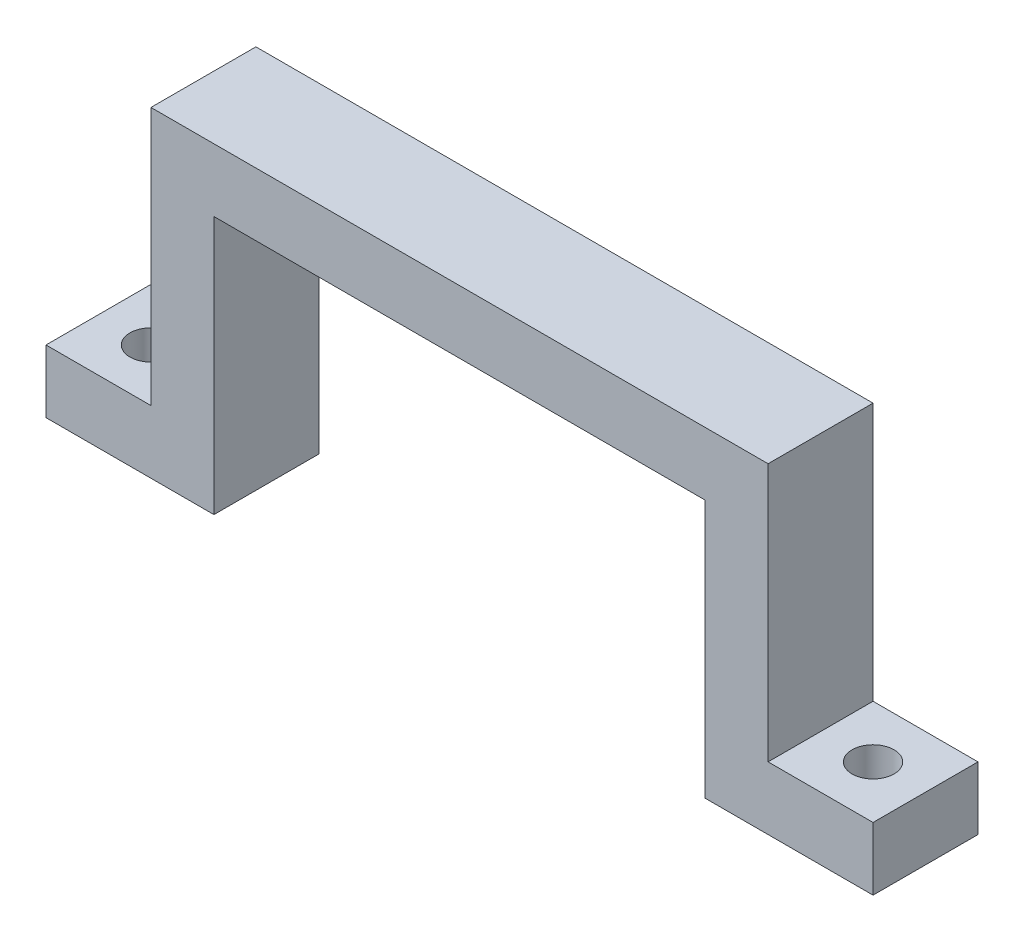
ISO-10303-21;
HEADER;
FILE_DESCRIPTION(('STEP AP214'),'2;1');
FILE_NAME('part.step','',(''),(''),'','','');
FILE_SCHEMA(('AUTOMOTIVE_DESIGN { 1 0 10303 214 1 1 1 1 }'));
ENDSEC;
DATA;
#1=APPLICATION_CONTEXT('core data for automotive mechanical design processes');
#2=APPLICATION_PROTOCOL_DEFINITION('international standard','automotive_design',2000,#1);
#3=PRODUCT_CONTEXT('',#1,'mechanical');
#4=PRODUCT('Part','Part','',(#3));
#5=PRODUCT_RELATED_PRODUCT_CATEGORY('part','',(#4));
#6=PRODUCT_DEFINITION_FORMATION('','',#4);
#7=PRODUCT_DEFINITION_CONTEXT('part definition',#1,'design');
#8=PRODUCT_DEFINITION('design','',#6,#7);
#9=PRODUCT_DEFINITION_SHAPE('','',#8);
#10=(LENGTH_UNIT() NAMED_UNIT(*) SI_UNIT(.MILLI.,.METRE.));
#11=(NAMED_UNIT(*) PLANE_ANGLE_UNIT() SI_UNIT($,.RADIAN.));
#12=(NAMED_UNIT(*) SI_UNIT($,.STERADIAN.) SOLID_ANGLE_UNIT());
#13=UNCERTAINTY_MEASURE_WITH_UNIT(LENGTH_MEASURE(1.E-05),#10,'distance_accuracy_value','');
#14=(GEOMETRIC_REPRESENTATION_CONTEXT(3) GLOBAL_UNCERTAINTY_ASSIGNED_CONTEXT((#13)) GLOBAL_UNIT_ASSIGNED_CONTEXT((#10,
#11,#12)) REPRESENTATION_CONTEXT('',''));
#15=CARTESIAN_POINT('',(0.,0.,0.));
#16=DIRECTION('',(0.,0.,1.));
#17=DIRECTION('',(1.,0.,0.));
#18=AXIS2_PLACEMENT_3D('',#15,#16,#17);
#19=CARTESIAN_POINT('',(-14.7,-15.3,-2.5));
#20=DIRECTION('',(-1.,0.,0.));
#21=DIRECTION('',(0.,0.,1.));
#22=AXIS2_PLACEMENT_3D('',#19,#20,#21);
#23=PLANE('',#22);
#24=DIRECTION('',(0.,1.,0.));
#25=VECTOR('',#24,1.);
#26=CARTESIAN_POINT('',(-14.7,-15.3,-2.5));
#27=LINE('',#26,#25);
#28=CARTESIAN_POINT('',(-14.7,-12.3,-2.5));
#29=VERTEX_POINT('',#28);
#30=CARTESIAN_POINT('',(-14.7,0.,-2.5));
#31=VERTEX_POINT('',#30);
#32=EDGE_CURVE('E221',#29,#31,#27,.T.);
#33=ORIENTED_EDGE('',*,*,#32,.F.);
#34=DIRECTION('',(0.,0.,1.));
#35=VECTOR('',#34,1.);
#36=CARTESIAN_POINT('',(-14.7,-12.3,2.5));
#37=LINE('',#36,#35);
#38=CARTESIAN_POINT('',(-14.7,-12.3,2.5));
#39=VERTEX_POINT('',#38);
#40=EDGE_CURVE('E142',#29,#39,#37,.T.);
#41=ORIENTED_EDGE('',*,*,#40,.T.);
#42=DIRECTION('',(0.,1.,0.));
#43=VECTOR('',#42,1.);
#44=CARTESIAN_POINT('',(-14.7,-15.3,2.5));
#45=LINE('',#44,#43);
#46=CARTESIAN_POINT('',(-14.7,0.,2.5));
#47=VERTEX_POINT('',#46);
#48=EDGE_CURVE('E42',#39,#47,#45,.T.);
#49=ORIENTED_EDGE('',*,*,#48,.T.);
#50=DIRECTION('',(0.,0.,1.));
#51=VECTOR('',#50,1.);
#52=CARTESIAN_POINT('',(-14.7,0.,-2.5));
#53=LINE('',#52,#51);
#54=EDGE_CURVE('E215',#31,#47,#53,.T.);
#55=ORIENTED_EDGE('',*,*,#54,.F.);
#56=EDGE_LOOP('',(#33,#41,#49,#55));
#57=FACE_BOUND('',#56,.T.);
#58=ADVANCED_FACE('F33',(#57),#23,.T.);
#59=CARTESIAN_POINT('',(0.,-15.3,0.));
#60=DIRECTION('',(0.,1.,0.));
#61=DIRECTION('',(0.,0.,1.));
#62=AXIS2_PLACEMENT_3D('',#59,#60,#61);
#63=PLANE('',#62);
#64=CARTESIAN_POINT('',(-17.2,-15.3,0.));
#65=DIRECTION('',(0.,1.,0.));
#66=DIRECTION('',(0.,0.,1.));
#67=AXIS2_PLACEMENT_3D('',#64,#65,#66);
#68=CIRCLE('',#67,1.);
#69=CARTESIAN_POINT('',(-17.2,-15.3,1.));
#70=VERTEX_POINT('',#69);
#71=EDGE_CURVE('E417',#70,#70,#68,.T.);
#72=ORIENTED_EDGE('',*,*,#71,.T.);
#73=EDGE_LOOP('',(#72));
#74=FACE_BOUND('',#73,.T.);
#75=DIRECTION('',(-1.,0.,0.));
#76=VECTOR('',#75,1.);
#77=CARTESIAN_POINT('',(-14.7,-15.3,-2.5));
#78=LINE('',#77,#76);
#79=CARTESIAN_POINT('',(-11.7,-15.3,-2.5));
#80=VERTEX_POINT('',#79);
#81=CARTESIAN_POINT('',(-19.7,-15.3,-2.5));
#82=VERTEX_POINT('',#81);
#83=EDGE_CURVE('E207',#80,#82,#78,.T.);
#84=ORIENTED_EDGE('',*,*,#83,.F.);
#85=DIRECTION('',(0.,0.,1.));
#86=VECTOR('',#85,1.);
#87=CARTESIAN_POINT('',(-11.7,-15.3,-2.501));
#88=LINE('',#87,#86);
#89=CARTESIAN_POINT('',(-11.7,-15.3,2.5));
#90=VERTEX_POINT('',#89);
#91=EDGE_CURVE('E193',#80,#90,#88,.T.);
#92=ORIENTED_EDGE('',*,*,#91,.T.);
#93=DIRECTION('',(1.,0.,0.));
#94=VECTOR('',#93,1.);
#95=CARTESIAN_POINT('',(-14.7,-15.3,2.5));
#96=LINE('',#95,#94);
#97=CARTESIAN_POINT('',(-19.7,-15.3,2.5));
#98=VERTEX_POINT('',#97);
#99=EDGE_CURVE('E208',#98,#90,#96,.T.);
#100=ORIENTED_EDGE('',*,*,#99,.F.);
#101=DIRECTION('',(0.,0.,-1.));
#102=VECTOR('',#101,1.);
#103=CARTESIAN_POINT('',(-19.7,-15.3,2.5));
#104=LINE('',#103,#102);
#105=EDGE_CURVE('E141',#98,#82,#104,.T.);
#106=ORIENTED_EDGE('',*,*,#105,.T.);
#107=EDGE_LOOP('',(#84,#92,#100,#106));
#108=FACE_BOUND('',#107,.T.);
#109=ADVANCED_FACE('F255',(#74,#108),#63,.F.);
#110=CARTESIAN_POINT('',(14.7,-15.3,-2.5));
#111=DIRECTION('',(1.,0.,0.));
#112=DIRECTION('',(0.,0.,-1.));
#113=AXIS2_PLACEMENT_3D('',#110,#111,#112);
#114=PLANE('',#113);
#115=DIRECTION('',(0.,0.,1.));
#116=VECTOR('',#115,1.);
#117=CARTESIAN_POINT('',(14.7,-12.3,2.5));
#118=LINE('',#117,#116);
#119=CARTESIAN_POINT('',(14.7,-12.3,-2.5));
#120=VERTEX_POINT('',#119);
#121=CARTESIAN_POINT('',(14.7,-12.3,2.5));
#122=VERTEX_POINT('',#121);
#123=EDGE_CURVE('E58',#120,#122,#118,.T.);
#124=ORIENTED_EDGE('',*,*,#123,.F.);
#125=DIRECTION('',(0.,1.,0.));
#126=VECTOR('',#125,1.);
#127=CARTESIAN_POINT('',(14.7,-15.3,-2.5));
#128=LINE('',#127,#126);
#129=CARTESIAN_POINT('',(14.7,0.,-2.5));
#130=VERTEX_POINT('',#129);
#131=EDGE_CURVE('E37',#120,#130,#128,.T.);
#132=ORIENTED_EDGE('',*,*,#131,.T.);
#133=DIRECTION('',(0.,0.,-1.));
#134=VECTOR('',#133,1.);
#135=CARTESIAN_POINT('',(14.7,0.,-2.5));
#136=LINE('',#135,#134);
#137=CARTESIAN_POINT('',(14.7,0.,2.5));
#138=VERTEX_POINT('',#137);
#139=EDGE_CURVE('E196',#138,#130,#136,.T.);
#140=ORIENTED_EDGE('',*,*,#139,.F.);
#141=DIRECTION('',(0.,1.,0.));
#142=VECTOR('',#141,1.);
#143=CARTESIAN_POINT('',(14.7,-15.3,2.5));
#144=LINE('',#143,#142);
#145=EDGE_CURVE('E11',#122,#138,#144,.T.);
#146=ORIENTED_EDGE('',*,*,#145,.F.);
#147=EDGE_LOOP('',(#124,#132,#140,#146));
#148=FACE_BOUND('',#147,.T.);
#149=ADVANCED_FACE('F35',(#148),#114,.T.);
#150=CARTESIAN_POINT('',(-14.7,-15.3,2.5));
#151=DIRECTION('',(0.,0.,1.));
#152=DIRECTION('',(1.,0.,0.));
#153=AXIS2_PLACEMENT_3D('',#150,#151,#152);
#154=PLANE('',#153);
#155=DIRECTION('',(0.,-1.,0.));
#156=VECTOR('',#155,1.);
#157=CARTESIAN_POINT('',(-11.7,-15.3,2.5));
#158=LINE('',#157,#156);
#159=CARTESIAN_POINT('',(-11.7,-3.,2.5));
#160=VERTEX_POINT('',#159);
#161=EDGE_CURVE('E185',#160,#90,#158,.T.);
#162=ORIENTED_EDGE('',*,*,#161,.F.);
#163=DIRECTION('',(-1.,0.,0.));
#164=VECTOR('',#163,1.);
#165=CARTESIAN_POINT('',(-11.7,-3.,2.5));
#166=LINE('',#165,#164);
#167=CARTESIAN_POINT('',(11.7,-3.,2.5));
#168=VERTEX_POINT('',#167);
#169=EDGE_CURVE('E190',#168,#160,#166,.T.);
#170=ORIENTED_EDGE('',*,*,#169,.F.);
#171=DIRECTION('',(0.,1.,0.));
#172=VECTOR('',#171,1.);
#173=CARTESIAN_POINT('',(11.7,-15.3,2.5));
#174=LINE('',#173,#172);
#175=CARTESIAN_POINT('',(11.7,-15.3,2.5));
#176=VERTEX_POINT('',#175);
#177=EDGE_CURVE('E187',#176,#168,#174,.T.);
#178=ORIENTED_EDGE('',*,*,#177,.F.);
#179=CARTESIAN_POINT('',(19.7,-15.3,2.5));
#180=VERTEX_POINT('',#179);
#181=EDGE_CURVE('E206',#176,#180,#96,.T.);
#182=ORIENTED_EDGE('',*,*,#181,.T.);
#183=DIRECTION('',(0.,-1.,0.));
#184=VECTOR('',#183,1.);
#185=CARTESIAN_POINT('',(19.7,-15.3,2.5));
#186=LINE('',#185,#184);
#187=CARTESIAN_POINT('',(19.7,-12.3,2.5));
#188=VERTEX_POINT('',#187);
#189=EDGE_CURVE('E159',#188,#180,#186,.T.);
#190=ORIENTED_EDGE('',*,*,#189,.F.);
#191=DIRECTION('',(-1.,0.,0.));
#192=VECTOR('',#191,1.);
#193=CARTESIAN_POINT('',(19.7,-12.3,2.5));
#194=LINE('',#193,#192);
#195=EDGE_CURVE('E169',#188,#122,#194,.T.);
#196=ORIENTED_EDGE('',*,*,#195,.T.);
#197=ORIENTED_EDGE('',*,*,#145,.T.);
#198=DIRECTION('',(1.,0.,0.));
#199=VECTOR('',#198,1.);
#200=CARTESIAN_POINT('',(-14.7,0.,2.5));
#201=LINE('',#200,#199);
#202=EDGE_CURVE('E218',#47,#138,#201,.T.);
#203=ORIENTED_EDGE('',*,*,#202,.F.);
#204=ORIENTED_EDGE('',*,*,#48,.F.);
#205=DIRECTION('',(1.,0.,0.));
#206=VECTOR('',#205,1.);
#207=CARTESIAN_POINT('',(-19.7,-12.3,2.5));
#208=LINE('',#207,#206);
#209=CARTESIAN_POINT('',(-19.7,-12.3,2.5));
#210=VERTEX_POINT('',#209);
#211=EDGE_CURVE('E50',#210,#39,#208,.T.);
#212=ORIENTED_EDGE('',*,*,#211,.F.);
#213=DIRECTION('',(0.,-1.,0.));
#214=VECTOR('',#213,1.);
#215=CARTESIAN_POINT('',(-19.7,-15.3,2.5));
#216=LINE('',#215,#214);
#217=EDGE_CURVE('E128',#210,#98,#216,.T.);
#218=ORIENTED_EDGE('',*,*,#217,.T.);
#219=ORIENTED_EDGE('',*,*,#99,.T.);
#220=EDGE_LOOP('',(#162,#170,#178,#182,#190,#196,#197,#203,#204,#212,#218,#219));
#221=FACE_BOUND('',#220,.T.);
#222=ADVANCED_FACE('F126',(#221),#154,.T.);
#223=CARTESIAN_POINT('',(-14.7,-15.3,-2.5));
#224=DIRECTION('',(0.,0.,-1.));
#225=DIRECTION('',(-1.,0.,0.));
#226=AXIS2_PLACEMENT_3D('',#223,#224,#225);
#227=PLANE('',#226);
#228=DIRECTION('',(0.,-1.,0.));
#229=VECTOR('',#228,1.);
#230=CARTESIAN_POINT('',(-11.7,-15.3,-2.5));
#231=LINE('',#230,#229);
#232=CARTESIAN_POINT('',(-11.7,-3.,-2.5));
#233=VERTEX_POINT('',#232);
#234=EDGE_CURVE('E182',#233,#80,#231,.T.);
#235=ORIENTED_EDGE('',*,*,#234,.T.);
#236=ORIENTED_EDGE('',*,*,#83,.T.);
#237=DIRECTION('',(0.,1.,0.));
#238=VECTOR('',#237,1.);
#239=CARTESIAN_POINT('',(-19.7,-15.3,-2.5));
#240=LINE('',#239,#238);
#241=CARTESIAN_POINT('',(-19.7,-12.3,-2.5));
#242=VERTEX_POINT('',#241);
#243=EDGE_CURVE('E145',#82,#242,#240,.T.);
#244=ORIENTED_EDGE('',*,*,#243,.T.);
#245=DIRECTION('',(1.,0.,0.));
#246=VECTOR('',#245,1.);
#247=CARTESIAN_POINT('',(-19.7,-12.3,-2.5));
#248=LINE('',#247,#246);
#249=EDGE_CURVE('E132',#242,#29,#248,.T.);
#250=ORIENTED_EDGE('',*,*,#249,.T.);
#251=ORIENTED_EDGE('',*,*,#32,.T.);
#252=DIRECTION('',(-1.,0.,0.));
#253=VECTOR('',#252,1.);
#254=CARTESIAN_POINT('',(-14.7,0.,-2.5));
#255=LINE('',#254,#253);
#256=EDGE_CURVE('E212',#130,#31,#255,.T.);
#257=ORIENTED_EDGE('',*,*,#256,.F.);
#258=ORIENTED_EDGE('',*,*,#131,.F.);
#259=DIRECTION('',(-1.,0.,0.));
#260=VECTOR('',#259,1.);
#261=CARTESIAN_POINT('',(19.7,-12.3,-2.5));
#262=LINE('',#261,#260);
#263=CARTESIAN_POINT('',(19.7,-12.3,-2.5));
#264=VERTEX_POINT('',#263);
#265=EDGE_CURVE('E173',#264,#120,#262,.T.);
#266=ORIENTED_EDGE('',*,*,#265,.F.);
#267=DIRECTION('',(0.,1.,0.));
#268=VECTOR('',#267,1.);
#269=CARTESIAN_POINT('',(19.7,-15.3,-2.5));
#270=LINE('',#269,#268);
#271=CARTESIAN_POINT('',(19.7,-15.3,-2.5));
#272=VERTEX_POINT('',#271);
#273=EDGE_CURVE('E165',#272,#264,#270,.T.);
#274=ORIENTED_EDGE('',*,*,#273,.F.);
#275=CARTESIAN_POINT('',(11.7,-15.3,-2.5));
#276=VERTEX_POINT('',#275);
#277=EDGE_CURVE('E203',#272,#276,#78,.T.);
#278=ORIENTED_EDGE('',*,*,#277,.T.);
#279=DIRECTION('',(0.,1.,0.));
#280=VECTOR('',#279,1.);
#281=CARTESIAN_POINT('',(11.7,-15.3,-2.5));
#282=LINE('',#281,#280);
#283=CARTESIAN_POINT('',(11.7,-3.,-2.5));
#284=VERTEX_POINT('',#283);
#285=EDGE_CURVE('E176',#276,#284,#282,.T.);
#286=ORIENTED_EDGE('',*,*,#285,.T.);
#287=DIRECTION('',(-1.,0.,0.));
#288=VECTOR('',#287,1.);
#289=CARTESIAN_POINT('',(-11.7,-3.,-2.5));
#290=LINE('',#289,#288);
#291=EDGE_CURVE('E179',#284,#233,#290,.T.);
#292=ORIENTED_EDGE('',*,*,#291,.T.);
#293=EDGE_LOOP('',(#235,#236,#244,#250,#251,#257,#258,#266,#274,#278,#286,#292));
#294=FACE_BOUND('',#293,.T.);
#295=ADVANCED_FACE('F228',(#294),#227,.T.);
#296=CARTESIAN_POINT('',(17.2,-15.3,0.));
#297=DIRECTION('',(0.,1.,0.));
#298=DIRECTION('',(0.,0.,1.));
#299=AXIS2_PLACEMENT_3D('',#296,#297,#298);
#300=CIRCLE('',#299,1.);
#301=CARTESIAN_POINT('',(17.2,-15.3,1.));
#302=VERTEX_POINT('',#301);
#303=EDGE_CURVE('E156',#302,#302,#300,.F.);
#304=ORIENTED_EDGE('',*,*,#303,.F.);
#305=EDGE_LOOP('',(#304));
#306=FACE_BOUND('',#305,.T.);
#307=ORIENTED_EDGE('',*,*,#181,.F.);
#308=DIRECTION('',(0.,0.,1.));
#309=VECTOR('',#308,1.);
#310=CARTESIAN_POINT('',(11.7,-15.3,-2.501));
#311=LINE('',#310,#309);
#312=EDGE_CURVE('E199',#276,#176,#311,.T.);
#313=ORIENTED_EDGE('',*,*,#312,.F.);
#314=ORIENTED_EDGE('',*,*,#277,.F.);
#315=DIRECTION('',(0.,0.,-1.));
#316=VECTOR('',#315,1.);
#317=CARTESIAN_POINT('',(19.7,-15.3,2.5));
#318=LINE('',#317,#316);
#319=EDGE_CURVE('E162',#180,#272,#318,.T.);
#320=ORIENTED_EDGE('',*,*,#319,.F.);
#321=EDGE_LOOP('',(#307,#313,#314,#320));
#322=FACE_BOUND('',#321,.T.);
#323=ADVANCED_FACE('F242',(#306,#322),#63,.F.);
#324=CARTESIAN_POINT('',(0.,0.,0.));
#325=DIRECTION('',(0.,1.,0.));
#326=DIRECTION('',(0.,0.,1.));
#327=AXIS2_PLACEMENT_3D('',#324,#325,#326);
#328=PLANE('',#327);
#329=ORIENTED_EDGE('',*,*,#139,.T.);
#330=ORIENTED_EDGE('',*,*,#256,.T.);
#331=ORIENTED_EDGE('',*,*,#54,.T.);
#332=ORIENTED_EDGE('',*,*,#202,.T.);
#333=EDGE_LOOP('',(#329,#330,#331,#332));
#334=FACE_BOUND('',#333,.T.);
#335=ADVANCED_FACE('F230',(#334),#328,.T.);
#336=CARTESIAN_POINT('',(-11.7,-15.3,-2.501));
#337=DIRECTION('',(-1.,0.,0.));
#338=DIRECTION('',(0.,-1.,0.));
#339=AXIS2_PLACEMENT_3D('',#336,#337,#338);
#340=PLANE('',#339);
#341=DIRECTION('',(0.,0.,1.));
#342=VECTOR('',#341,1.);
#343=CARTESIAN_POINT('',(-11.7,-3.,-2.501));
#344=LINE('',#343,#342);
#345=EDGE_CURVE('E194',#233,#160,#344,.T.);
#346=ORIENTED_EDGE('',*,*,#345,.T.);
#347=ORIENTED_EDGE('',*,*,#161,.T.);
#348=ORIENTED_EDGE('',*,*,#91,.F.);
#349=ORIENTED_EDGE('',*,*,#234,.F.);
#350=EDGE_LOOP('',(#346,#347,#348,#349));
#351=FACE_BOUND('',#350,.T.);
#352=ADVANCED_FACE('F256',(#351),#340,.F.);
#353=CARTESIAN_POINT('',(-11.7,-3.,-2.501));
#354=DIRECTION('',(0.,1.,0.));
#355=DIRECTION('',(0.,0.,1.));
#356=AXIS2_PLACEMENT_3D('',#353,#354,#355);
#357=PLANE('',#356);
#358=DIRECTION('',(0.,0.,1.));
#359=VECTOR('',#358,1.);
#360=CARTESIAN_POINT('',(11.7,-3.,-2.501));
#361=LINE('',#360,#359);
#362=EDGE_CURVE('E197',#284,#168,#361,.T.);
#363=ORIENTED_EDGE('',*,*,#362,.T.);
#364=ORIENTED_EDGE('',*,*,#169,.T.);
#365=ORIENTED_EDGE('',*,*,#345,.F.);
#366=ORIENTED_EDGE('',*,*,#291,.F.);
#367=EDGE_LOOP('',(#363,#364,#365,#366));
#368=FACE_BOUND('',#367,.T.);
#369=ADVANCED_FACE('F251',(#368),#357,.F.);
#370=CARTESIAN_POINT('',(11.7,-15.3,-2.501));
#371=DIRECTION('',(1.,0.,0.));
#372=DIRECTION('',(0.,1.,0.));
#373=AXIS2_PLACEMENT_3D('',#370,#371,#372);
#374=PLANE('',#373);
#375=ORIENTED_EDGE('',*,*,#312,.T.);
#376=ORIENTED_EDGE('',*,*,#177,.T.);
#377=ORIENTED_EDGE('',*,*,#362,.F.);
#378=ORIENTED_EDGE('',*,*,#285,.F.);
#379=EDGE_LOOP('',(#375,#376,#377,#378));
#380=FACE_BOUND('',#379,.T.);
#381=ADVANCED_FACE('F246',(#380),#374,.F.);
#382=CARTESIAN_POINT('',(19.7,-12.3,2.5));
#383=DIRECTION('',(0.,-1.,0.));
#384=DIRECTION('',(0.,0.,-1.));
#385=AXIS2_PLACEMENT_3D('',#382,#383,#384);
#386=PLANE('',#385);
#387=CARTESIAN_POINT('',(17.2,-12.3,0.));
#388=DIRECTION('',(0.,1.,0.));
#389=DIRECTION('',(0.,0.,1.));
#390=AXIS2_PLACEMENT_3D('',#387,#388,#389);
#391=CIRCLE('',#390,1.);
#392=CARTESIAN_POINT('',(17.2,-12.3,1.));
#393=VERTEX_POINT('',#392);
#394=EDGE_CURVE('E131',#393,#393,#391,.T.);
#395=ORIENTED_EDGE('',*,*,#394,.F.);
#396=EDGE_LOOP('',(#395));
#397=FACE_BOUND('',#396,.T.);
#398=ORIENTED_EDGE('',*,*,#123,.T.);
#399=ORIENTED_EDGE('',*,*,#195,.F.);
#400=DIRECTION('',(0.,0.,1.));
#401=VECTOR('',#400,1.);
#402=CARTESIAN_POINT('',(19.7,-12.3,2.5));
#403=LINE('',#402,#401);
#404=EDGE_CURVE('E167',#264,#188,#403,.T.);
#405=ORIENTED_EDGE('',*,*,#404,.F.);
#406=ORIENTED_EDGE('',*,*,#265,.T.);
#407=EDGE_LOOP('',(#398,#399,#405,#406));
#408=FACE_BOUND('',#407,.T.);
#409=ADVANCED_FACE('F234',(#397,#408),#386,.F.);
#410=CARTESIAN_POINT('',(19.7,0.,0.));
#411=DIRECTION('',(-1.,0.,0.));
#412=DIRECTION('',(0.,0.,1.));
#413=AXIS2_PLACEMENT_3D('',#410,#411,#412);
#414=PLANE('',#413);
#415=ORIENTED_EDGE('',*,*,#189,.T.);
#416=ORIENTED_EDGE('',*,*,#319,.T.);
#417=ORIENTED_EDGE('',*,*,#273,.T.);
#418=ORIENTED_EDGE('',*,*,#404,.T.);
#419=EDGE_LOOP('',(#415,#416,#417,#418));
#420=FACE_BOUND('',#419,.T.);
#421=ADVANCED_FACE('F238',(#420),#414,.F.);
#422=CARTESIAN_POINT('',(17.2,-15.301,0.));
#423=DIRECTION('',(0.,1.,0.));
#424=DIRECTION('',(0.,0.,1.));
#425=AXIS2_PLACEMENT_3D('',#422,#423,#424);
#426=CYLINDRICAL_SURFACE('',#425,1.);
#427=ORIENTED_EDGE('',*,*,#394,.T.);
#428=EDGE_LOOP('',(#427));
#429=FACE_BOUND('',#428,.T.);
#430=ORIENTED_EDGE('',*,*,#303,.T.);
#431=EDGE_LOOP('',(#430));
#432=FACE_BOUND('',#431,.T.);
#433=ADVANCED_FACE('F315',(#429,#432),#426,.F.);
#434=CARTESIAN_POINT('',(-19.7,-12.3,2.5));
#435=DIRECTION('',(0.,1.,0.));
#436=DIRECTION('',(0.,0.,1.));
#437=AXIS2_PLACEMENT_3D('',#434,#435,#436);
#438=PLANE('',#437);
#439=CARTESIAN_POINT('',(-17.2,-12.3,0.));
#440=DIRECTION('',(0.,-1.,0.));
#441=DIRECTION('',(0.,0.,1.));
#442=AXIS2_PLACEMENT_3D('',#439,#440,#441);
#443=CIRCLE('',#442,1.);
#444=CARTESIAN_POINT('',(-17.2,-12.3,1.));
#445=VERTEX_POINT('',#444);
#446=EDGE_CURVE('E152',#445,#445,#443,.T.);
#447=ORIENTED_EDGE('',*,*,#446,.T.);
#448=EDGE_LOOP('',(#447));
#449=FACE_BOUND('',#448,.T.);
#450=ORIENTED_EDGE('',*,*,#40,.F.);
#451=ORIENTED_EDGE('',*,*,#249,.F.);
#452=DIRECTION('',(0.,0.,1.));
#453=VECTOR('',#452,1.);
#454=CARTESIAN_POINT('',(-19.7,-12.3,2.5));
#455=LINE('',#454,#453);
#456=EDGE_CURVE('E138',#242,#210,#455,.T.);
#457=ORIENTED_EDGE('',*,*,#456,.T.);
#458=ORIENTED_EDGE('',*,*,#211,.T.);
#459=EDGE_LOOP('',(#450,#451,#457,#458));
#460=FACE_BOUND('',#459,.T.);
#461=ADVANCED_FACE('F144',(#449,#460),#438,.T.);
#462=CARTESIAN_POINT('',(-19.7,0.,0.));
#463=DIRECTION('',(1.,0.,0.));
#464=DIRECTION('',(0.,0.,1.));
#465=AXIS2_PLACEMENT_3D('',#462,#463,#464);
#466=PLANE('',#465);
#467=ORIENTED_EDGE('',*,*,#217,.F.);
#468=ORIENTED_EDGE('',*,*,#456,.F.);
#469=ORIENTED_EDGE('',*,*,#243,.F.);
#470=ORIENTED_EDGE('',*,*,#105,.F.);
#471=EDGE_LOOP('',(#467,#468,#469,#470));
#472=FACE_BOUND('',#471,.T.);
#473=ADVANCED_FACE('F136',(#472),#466,.F.);
#474=CARTESIAN_POINT('',(-17.2,-15.301,0.));
#475=DIRECTION('',(0.,1.,0.));
#476=DIRECTION('',(0.,0.,1.));
#477=AXIS2_PLACEMENT_3D('',#474,#475,#476);
#478=CYLINDRICAL_SURFACE('',#477,1.);
#479=ORIENTED_EDGE('',*,*,#446,.F.);
#480=EDGE_LOOP('',(#479));
#481=FACE_BOUND('',#480,.T.);
#482=ORIENTED_EDGE('',*,*,#71,.F.);
#483=EDGE_LOOP('',(#482));
#484=FACE_BOUND('',#483,.T.);
#485=ADVANCED_FACE('F326',(#481,#484),#478,.F.);
#486=CLOSED_SHELL('',(#58,#109,#149,#222,#295,#323,#335,#352,#369,#381,#409,#421,#433,#461,#473,#485));
#487=MANIFOLD_SOLID_BREP('B2',#486);
#488=ADVANCED_BREP_SHAPE_REPRESENTATION('',(#18,#487),#14);
#489=SHAPE_DEFINITION_REPRESENTATION(#9,#488);
ENDSEC;
END-ISO-10303-21;
